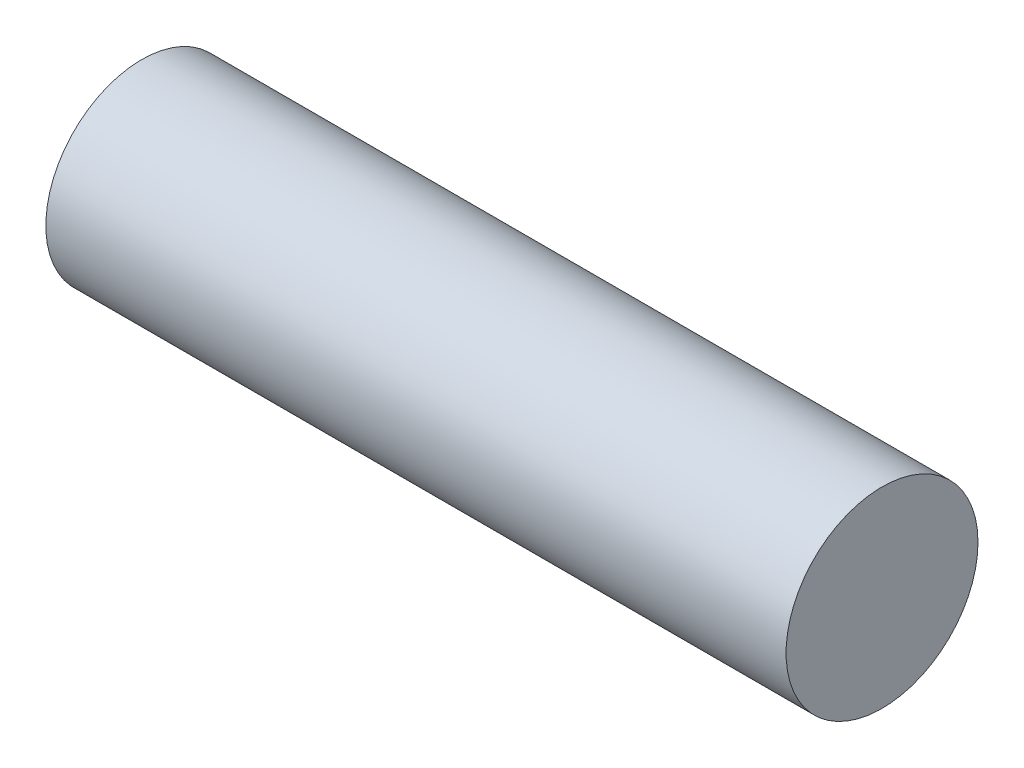
ISO-10303-21;
HEADER;
FILE_DESCRIPTION(('STEP AP214'),'2;1');
FILE_NAME('part.step','',(''),(''),'','','');
FILE_SCHEMA(('AUTOMOTIVE_DESIGN { 1 0 10303 214 1 1 1 1 }'));
ENDSEC;
DATA;
#1=APPLICATION_CONTEXT('core data for automotive mechanical design processes');
#2=APPLICATION_PROTOCOL_DEFINITION('international standard','automotive_design',2000,#1);
#3=PRODUCT_CONTEXT('',#1,'mechanical');
#4=PRODUCT('Part','Part','',(#3));
#5=PRODUCT_RELATED_PRODUCT_CATEGORY('part','',(#4));
#6=PRODUCT_DEFINITION_FORMATION('','',#4);
#7=PRODUCT_DEFINITION_CONTEXT('part definition',#1,'design');
#8=PRODUCT_DEFINITION('design','',#6,#7);
#9=PRODUCT_DEFINITION_SHAPE('','',#8);
#10=(LENGTH_UNIT() NAMED_UNIT(*) SI_UNIT(.MILLI.,.METRE.));
#11=(NAMED_UNIT(*) PLANE_ANGLE_UNIT() SI_UNIT($,.RADIAN.));
#12=(NAMED_UNIT(*) SI_UNIT($,.STERADIAN.) SOLID_ANGLE_UNIT());
#13=UNCERTAINTY_MEASURE_WITH_UNIT(LENGTH_MEASURE(1.E-05),#10,'distance_accuracy_value','');
#14=(GEOMETRIC_REPRESENTATION_CONTEXT(3) GLOBAL_UNCERTAINTY_ASSIGNED_CONTEXT((#13)) GLOBAL_UNIT_ASSIGNED_CONTEXT((#10,
#11,#12)) REPRESENTATION_CONTEXT('',''));
#15=CARTESIAN_POINT('',(0.,0.,0.));
#16=DIRECTION('',(0.,0.,1.));
#17=DIRECTION('',(1.,0.,0.));
#18=AXIS2_PLACEMENT_3D('',#15,#16,#17);
#19=CARTESIAN_POINT('',(13.5,0.,0.));
#20=DIRECTION('',(-1.,0.,0.));
#21=DIRECTION('',(0.,0.,1.));
#22=AXIS2_PLACEMENT_3D('',#19,#20,#21);
#23=CYLINDRICAL_SURFACE('',#22,3.5);
#24=CARTESIAN_POINT('',(13.5,0.,0.));
#25=DIRECTION('',(1.,0.,0.));
#26=DIRECTION('',(0.,0.,-1.));
#27=AXIS2_PLACEMENT_3D('',#24,#25,#26);
#28=CIRCLE('',#27,3.5);
#29=CARTESIAN_POINT('',(13.5,0.,-3.5));
#30=VERTEX_POINT('',#29);
#31=EDGE_CURVE('E12',#30,#30,#28,.T.);
#32=ORIENTED_EDGE('',*,*,#31,.F.);
#33=EDGE_LOOP('',(#32));
#34=FACE_BOUND('',#33,.T.);
#35=CARTESIAN_POINT('',(-13.5,0.,0.));
#36=DIRECTION('',(1.,0.,0.));
#37=DIRECTION('',(0.,0.,-1.));
#38=AXIS2_PLACEMENT_3D('',#35,#36,#37);
#39=CIRCLE('',#38,3.5);
#40=CARTESIAN_POINT('',(-13.5,0.,-3.5));
#41=VERTEX_POINT('',#40);
#42=EDGE_CURVE('E45',#41,#41,#39,.T.);
#43=ORIENTED_EDGE('',*,*,#42,.T.);
#44=EDGE_LOOP('',(#43));
#45=FACE_BOUND('',#44,.T.);
#46=ADVANCED_FACE('F42',(#34,#45),#23,.T.);
#47=CARTESIAN_POINT('',(13.5,0.,0.));
#48=DIRECTION('',(1.,0.,0.));
#49=DIRECTION('',(0.,0.,-1.));
#50=AXIS2_PLACEMENT_3D('',#47,#48,#49);
#51=PLANE('',#50);
#52=ORIENTED_EDGE('',*,*,#31,.T.);
#53=EDGE_LOOP('',(#52));
#54=FACE_BOUND('',#53,.T.);
#55=ADVANCED_FACE('F57',(#54),#51,.T.);
#56=CARTESIAN_POINT('',(-13.5,0.,0.));
#57=DIRECTION('',(1.,0.,0.));
#58=DIRECTION('',(0.,0.,-1.));
#59=AXIS2_PLACEMENT_3D('',#56,#57,#58);
#60=PLANE('',#59);
#61=ORIENTED_EDGE('',*,*,#42,.F.);
#62=EDGE_LOOP('',(#61));
#63=FACE_BOUND('',#62,.T.);
#64=ADVANCED_FACE('F55',(#63),#60,.F.);
#65=CLOSED_SHELL('',(#46,#55,#64));
#66=MANIFOLD_SOLID_BREP('B2',#65);
#67=ADVANCED_BREP_SHAPE_REPRESENTATION('',(#18,#66),#14);
#68=SHAPE_DEFINITION_REPRESENTATION(#9,#67);
ENDSEC;
END-ISO-10303-21;
